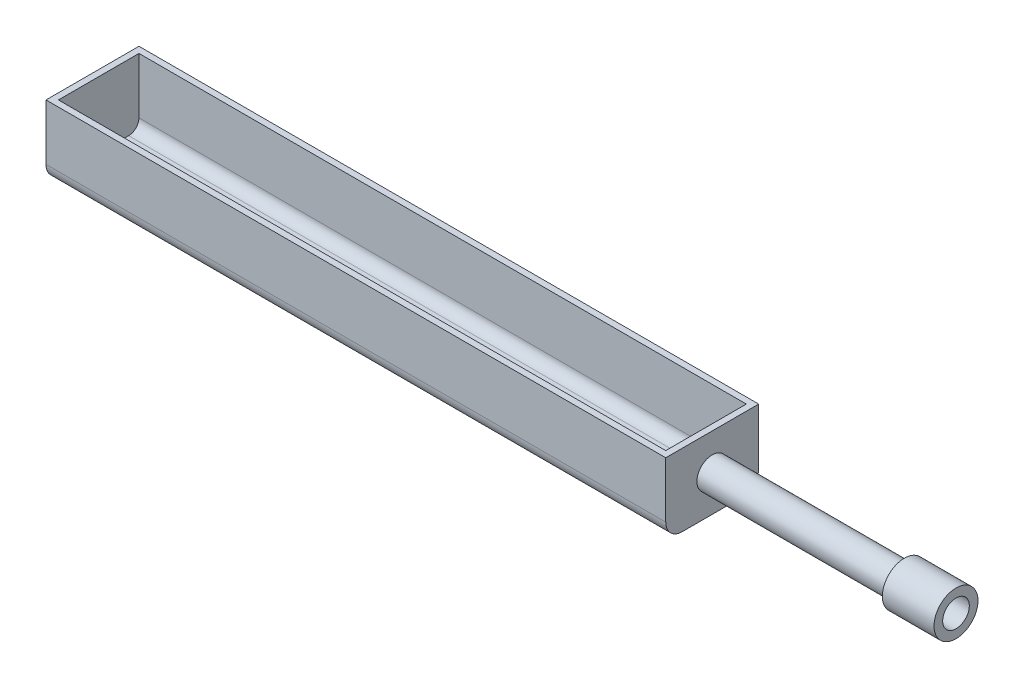
ISO-10303-21;
HEADER;
FILE_DESCRIPTION(('STEP AP214'),'2;1');
FILE_NAME('part.step','',(''),(''),'','','');
FILE_SCHEMA(('AUTOMOTIVE_DESIGN { 1 0 10303 214 1 1 1 1 }'));
ENDSEC;
DATA;
#1=APPLICATION_CONTEXT('core data for automotive mechanical design processes');
#2=APPLICATION_PROTOCOL_DEFINITION('international standard','automotive_design',2000,#1);
#3=PRODUCT_CONTEXT('',#1,'mechanical');
#4=PRODUCT('Part','Part','',(#3));
#5=PRODUCT_RELATED_PRODUCT_CATEGORY('part','',(#4));
#6=PRODUCT_DEFINITION_FORMATION('','',#4);
#7=PRODUCT_DEFINITION_CONTEXT('part definition',#1,'design');
#8=PRODUCT_DEFINITION('design','',#6,#7);
#9=PRODUCT_DEFINITION_SHAPE('','',#8);
#10=(LENGTH_UNIT() NAMED_UNIT(*) SI_UNIT(.MILLI.,.METRE.));
#11=(NAMED_UNIT(*) PLANE_ANGLE_UNIT() SI_UNIT($,.RADIAN.));
#12=(NAMED_UNIT(*) SI_UNIT($,.STERADIAN.) SOLID_ANGLE_UNIT());
#13=UNCERTAINTY_MEASURE_WITH_UNIT(LENGTH_MEASURE(1.E-05),#10,'distance_accuracy_value','');
#14=(GEOMETRIC_REPRESENTATION_CONTEXT(3) GLOBAL_UNCERTAINTY_ASSIGNED_CONTEXT((#13)) GLOBAL_UNIT_ASSIGNED_CONTEXT((#10,
#11,#12)) REPRESENTATION_CONTEXT('',''));
#15=CARTESIAN_POINT('',(0.,0.,0.));
#16=DIRECTION('',(0.,0.,1.));
#17=DIRECTION('',(1.,0.,0.));
#18=AXIS2_PLACEMENT_3D('',#15,#16,#17);
#19=CARTESIAN_POINT('',(300.,17.5,-22.5));
#20=DIRECTION('',(0.,-1.,0.));
#21=DIRECTION('',(0.,0.,-1.));
#22=AXIS2_PLACEMENT_3D('',#19,#20,#21);
#23=PLANE('',#22);
#24=DIRECTION('',(0.,0.,1.));
#25=VECTOR('',#24,1.);
#26=CARTESIAN_POINT('',(0.,17.5,-22.5));
#27=LINE('',#26,#25);
#28=CARTESIAN_POINT('',(0.,17.5,-22.5));
#29=VERTEX_POINT('',#28);
#30=CARTESIAN_POINT('',(0.,17.5,22.5));
#31=VERTEX_POINT('',#30);
#32=EDGE_CURVE('E180',#29,#31,#27,.T.);
#33=ORIENTED_EDGE('',*,*,#32,.T.);
#34=DIRECTION('',(-1.,0.,0.));
#35=VECTOR('',#34,1.);
#36=CARTESIAN_POINT('',(300.,17.5,22.5));
#37=LINE('',#36,#35);
#38=CARTESIAN_POINT('',(300.,17.5,22.5));
#39=VERTEX_POINT('',#38);
#40=EDGE_CURVE('E187',#39,#31,#37,.T.);
#41=ORIENTED_EDGE('',*,*,#40,.F.);
#42=DIRECTION('',(0.,0.,1.));
#43=VECTOR('',#42,1.);
#44=CARTESIAN_POINT('',(300.,17.5,-22.5));
#45=LINE('',#44,#43);
#46=CARTESIAN_POINT('',(300.,17.5,-22.5));
#47=VERTEX_POINT('',#46);
#48=EDGE_CURVE('E185',#47,#39,#45,.T.);
#49=ORIENTED_EDGE('',*,*,#48,.F.);
#50=DIRECTION('',(-1.,0.,0.));
#51=VECTOR('',#50,1.);
#52=CARTESIAN_POINT('',(300.,17.5,-22.5));
#53=LINE('',#52,#51);
#54=EDGE_CURVE('E197',#47,#29,#53,.T.);
#55=ORIENTED_EDGE('',*,*,#54,.T.);
#56=EDGE_LOOP('',(#33,#41,#49,#55));
#57=FACE_BOUND('',#56,.T.);
#58=DIRECTION('',(0.,0.,1.));
#59=VECTOR('',#58,1.);
#60=CARTESIAN_POINT('',(3.,17.5,-22.5));
#61=LINE('',#60,#59);
#62=CARTESIAN_POINT('',(3.,17.5,-19.5));
#63=VERTEX_POINT('',#62);
#64=CARTESIAN_POINT('',(3.,17.5,19.5));
#65=VERTEX_POINT('',#64);
#66=EDGE_CURVE('E144',#63,#65,#61,.T.);
#67=ORIENTED_EDGE('',*,*,#66,.F.);
#68=DIRECTION('',(-1.,0.,0.));
#69=VECTOR('',#68,1.);
#70=CARTESIAN_POINT('',(300.,17.5,-19.5));
#71=LINE('',#70,#69);
#72=CARTESIAN_POINT('',(297.,17.5,-19.5));
#73=VERTEX_POINT('',#72);
#74=EDGE_CURVE('E171',#73,#63,#71,.T.);
#75=ORIENTED_EDGE('',*,*,#74,.F.);
#76=DIRECTION('',(0.,0.,1.));
#77=VECTOR('',#76,1.);
#78=CARTESIAN_POINT('',(297.,17.5,-22.5));
#79=LINE('',#78,#77);
#80=CARTESIAN_POINT('',(297.,17.5,19.5));
#81=VERTEX_POINT('',#80);
#82=EDGE_CURVE('E48',#73,#81,#79,.T.);
#83=ORIENTED_EDGE('',*,*,#82,.T.);
#84=DIRECTION('',(-1.,0.,0.));
#85=VECTOR('',#84,1.);
#86=CARTESIAN_POINT('',(300.,17.5,19.5));
#87=LINE('',#86,#85);
#88=EDGE_CURVE('E142',#81,#65,#87,.T.);
#89=ORIENTED_EDGE('',*,*,#88,.T.);
#90=EDGE_LOOP('',(#67,#75,#83,#89));
#91=FACE_BOUND('',#90,.T.);
#92=ADVANCED_FACE('F32',(#57,#91),#23,.F.);
#93=CARTESIAN_POINT('',(300.,-17.5,22.5));
#94=DIRECTION('',(0.,0.,-1.));
#95=DIRECTION('',(-1.,0.,0.));
#96=AXIS2_PLACEMENT_3D('',#93,#94,#95);
#97=PLANE('',#96);
#98=DIRECTION('',(0.,-1.,0.));
#99=VECTOR('',#98,1.);
#100=CARTESIAN_POINT('',(0.,-17.5,22.5));
#101=LINE('',#100,#99);
#102=CARTESIAN_POINT('',(0.,-9.5,22.5));
#103=VERTEX_POINT('',#102);
#104=EDGE_CURVE('E136',#31,#103,#101,.T.);
#105=ORIENTED_EDGE('',*,*,#104,.T.);
#106=DIRECTION('',(-1.,0.,0.));
#107=VECTOR('',#106,1.);
#108=CARTESIAN_POINT('',(300.,-9.5,22.5));
#109=LINE('',#108,#107);
#110=CARTESIAN_POINT('',(300.,-9.5,22.5));
#111=VERTEX_POINT('',#110);
#112=EDGE_CURVE('E56',#103,#111,#109,.F.);
#113=ORIENTED_EDGE('',*,*,#112,.T.);
#114=DIRECTION('',(0.,-1.,0.));
#115=VECTOR('',#114,1.);
#116=CARTESIAN_POINT('',(300.,-17.5,22.5));
#117=LINE('',#116,#115);
#118=EDGE_CURVE('E177',#39,#111,#117,.T.);
#119=ORIENTED_EDGE('',*,*,#118,.F.);
#120=ORIENTED_EDGE('',*,*,#40,.T.);
#121=EDGE_LOOP('',(#105,#113,#119,#120));
#122=FACE_BOUND('',#121,.T.);
#123=ADVANCED_FACE('F260',(#122),#97,.F.);
#124=CARTESIAN_POINT('',(300.,-17.5,-22.5));
#125=DIRECTION('',(0.,1.,0.));
#126=DIRECTION('',(0.,0.,1.));
#127=AXIS2_PLACEMENT_3D('',#124,#125,#126);
#128=PLANE('',#127);
#129=DIRECTION('',(0.,0.,-1.));
#130=VECTOR('',#129,1.);
#131=CARTESIAN_POINT('',(0.,-17.5,-22.5));
#132=LINE('',#131,#130);
#133=CARTESIAN_POINT('',(0.,-17.5,14.5));
#134=VERTEX_POINT('',#133);
#135=CARTESIAN_POINT('',(0.,-17.5,-14.5));
#136=VERTEX_POINT('',#135);
#137=EDGE_CURVE('E189',#134,#136,#132,.T.);
#138=ORIENTED_EDGE('',*,*,#137,.T.);
#139=DIRECTION('',(-1.,0.,0.));
#140=VECTOR('',#139,1.);
#141=CARTESIAN_POINT('',(300.,-17.5,-14.5));
#142=LINE('',#141,#140);
#143=CARTESIAN_POINT('',(300.,-17.5,-14.5));
#144=VERTEX_POINT('',#143);
#145=EDGE_CURVE('E210',#136,#144,#142,.F.);
#146=ORIENTED_EDGE('',*,*,#145,.T.);
#147=DIRECTION('',(0.,0.,-1.));
#148=VECTOR('',#147,1.);
#149=CARTESIAN_POINT('',(300.,-17.5,-22.5));
#150=LINE('',#149,#148);
#151=CARTESIAN_POINT('',(300.,-17.5,14.5));
#152=VERTEX_POINT('',#151);
#153=EDGE_CURVE('E179',#152,#144,#150,.T.);
#154=ORIENTED_EDGE('',*,*,#153,.F.);
#155=DIRECTION('',(-1.,0.,0.));
#156=VECTOR('',#155,1.);
#157=CARTESIAN_POINT('',(300.,-17.5,14.5));
#158=LINE('',#157,#156);
#159=EDGE_CURVE('E207',#152,#134,#158,.T.);
#160=ORIENTED_EDGE('',*,*,#159,.T.);
#161=EDGE_LOOP('',(#138,#146,#154,#160));
#162=FACE_BOUND('',#161,.T.);
#163=ADVANCED_FACE('F266',(#162),#128,.F.);
#164=CARTESIAN_POINT('',(300.,-17.5,-22.5));
#165=DIRECTION('',(0.,0.,1.));
#166=DIRECTION('',(1.,0.,0.));
#167=AXIS2_PLACEMENT_3D('',#164,#165,#166);
#168=PLANE('',#167);
#169=DIRECTION('',(0.,1.,0.));
#170=VECTOR('',#169,1.);
#171=CARTESIAN_POINT('',(300.,-17.5,-22.5));
#172=LINE('',#171,#170);
#173=CARTESIAN_POINT('',(300.,-9.5,-22.5));
#174=VERTEX_POINT('',#173);
#175=EDGE_CURVE('E183',#174,#47,#172,.T.);
#176=ORIENTED_EDGE('',*,*,#175,.F.);
#177=DIRECTION('',(-1.,0.,0.));
#178=VECTOR('',#177,1.);
#179=CARTESIAN_POINT('',(300.,-9.5,-22.5));
#180=LINE('',#179,#178);
#181=CARTESIAN_POINT('',(0.,-9.5,-22.5));
#182=VERTEX_POINT('',#181);
#183=EDGE_CURVE('E200',#174,#182,#180,.T.);
#184=ORIENTED_EDGE('',*,*,#183,.T.);
#185=DIRECTION('',(0.,1.,0.));
#186=VECTOR('',#185,1.);
#187=CARTESIAN_POINT('',(0.,-17.5,-22.5));
#188=LINE('',#187,#186);
#189=EDGE_CURVE('E192',#182,#29,#188,.T.);
#190=ORIENTED_EDGE('',*,*,#189,.T.);
#191=ORIENTED_EDGE('',*,*,#54,.F.);
#192=EDGE_LOOP('',(#176,#184,#190,#191));
#193=FACE_BOUND('',#192,.T.);
#194=ADVANCED_FACE('F272',(#193),#168,.F.);
#195=CARTESIAN_POINT('',(300.,0.,0.));
#196=DIRECTION('',(1.,0.,0.));
#197=DIRECTION('',(0.,0.,-1.));
#198=AXIS2_PLACEMENT_3D('',#195,#196,#197);
#199=PLANE('',#198);
#200=CARTESIAN_POINT('',(300.,0.,0.));
#201=DIRECTION('',(1.,0.,0.));
#202=DIRECTION('',(0.,0.,-1.));
#203=AXIS2_PLACEMENT_3D('',#200,#201,#202);
#204=CIRCLE('',#203,7.45);
#205=CARTESIAN_POINT('',(300.,0.,-7.45));
#206=VERTEX_POINT('',#205);
#207=EDGE_CURVE('E218',#206,#206,#204,.F.);
#208=ORIENTED_EDGE('',*,*,#207,.T.);
#209=EDGE_LOOP('',(#208));
#210=FACE_BOUND('',#209,.T.);
#211=ORIENTED_EDGE('',*,*,#153,.T.);
#212=CARTESIAN_POINT('',(300.,-9.5,-14.5));
#213=DIRECTION('',(1.,0.,0.));
#214=DIRECTION('',(0.,0.,-1.));
#215=AXIS2_PLACEMENT_3D('',#212,#213,#214);
#216=CIRCLE('',#215,8.);
#217=EDGE_CURVE('E214',#144,#174,#216,.T.);
#218=ORIENTED_EDGE('',*,*,#217,.T.);
#219=ORIENTED_EDGE('',*,*,#175,.T.);
#220=ORIENTED_EDGE('',*,*,#48,.T.);
#221=ORIENTED_EDGE('',*,*,#118,.T.);
#222=CARTESIAN_POINT('',(300.,-9.5,14.5));
#223=DIRECTION('',(1.,0.,0.));
#224=DIRECTION('',(0.,0.,-1.));
#225=AXIS2_PLACEMENT_3D('',#222,#223,#224);
#226=CIRCLE('',#225,8.);
#227=EDGE_CURVE('E212',#111,#152,#226,.T.);
#228=ORIENTED_EDGE('',*,*,#227,.T.);
#229=EDGE_LOOP('',(#211,#218,#219,#220,#221,#228));
#230=FACE_BOUND('',#229,.T.);
#231=ADVANCED_FACE('F275',(#210,#230),#199,.T.);
#232=CARTESIAN_POINT('',(0.,0.,0.));
#233=DIRECTION('',(1.,0.,0.));
#234=DIRECTION('',(0.,0.,-1.));
#235=AXIS2_PLACEMENT_3D('',#232,#233,#234);
#236=PLANE('',#235);
#237=ORIENTED_EDGE('',*,*,#189,.F.);
#238=CARTESIAN_POINT('',(0.,-9.5,-14.5));
#239=DIRECTION('',(1.,0.,0.));
#240=DIRECTION('',(0.,0.,-1.));
#241=AXIS2_PLACEMENT_3D('',#238,#239,#240);
#242=CIRCLE('',#241,8.);
#243=EDGE_CURVE('E205',#182,#136,#242,.F.);
#244=ORIENTED_EDGE('',*,*,#243,.T.);
#245=ORIENTED_EDGE('',*,*,#137,.F.);
#246=CARTESIAN_POINT('',(0.,-9.5,14.5));
#247=DIRECTION('',(1.,0.,0.));
#248=DIRECTION('',(0.,0.,-1.));
#249=AXIS2_PLACEMENT_3D('',#246,#247,#248);
#250=CIRCLE('',#249,8.);
#251=EDGE_CURVE('E203',#134,#103,#250,.F.);
#252=ORIENTED_EDGE('',*,*,#251,.T.);
#253=ORIENTED_EDGE('',*,*,#104,.F.);
#254=ORIENTED_EDGE('',*,*,#32,.F.);
#255=EDGE_LOOP('',(#237,#244,#245,#252,#253,#254));
#256=FACE_BOUND('',#255,.T.);
#257=ADVANCED_FACE('F270',(#256),#236,.F.);
#258=CARTESIAN_POINT('',(300.,-9.5,-14.5));
#259=DIRECTION('',(-1.,0.,0.));
#260=DIRECTION('',(0.,0.,1.));
#261=AXIS2_PLACEMENT_3D('',#258,#259,#260);
#262=CYLINDRICAL_SURFACE('',#261,8.);
#263=ORIENTED_EDGE('',*,*,#217,.F.);
#264=ORIENTED_EDGE('',*,*,#145,.F.);
#265=ORIENTED_EDGE('',*,*,#243,.F.);
#266=ORIENTED_EDGE('',*,*,#183,.F.);
#267=EDGE_LOOP('',(#263,#264,#265,#266));
#268=FACE_BOUND('',#267,.T.);
#269=ADVANCED_FACE('F279',(#268),#262,.T.);
#270=CARTESIAN_POINT('',(300.,-9.5,14.5));
#271=DIRECTION('',(-1.,0.,0.));
#272=DIRECTION('',(0.,0.,1.));
#273=AXIS2_PLACEMENT_3D('',#270,#271,#272);
#274=CYLINDRICAL_SURFACE('',#273,8.);
#275=ORIENTED_EDGE('',*,*,#227,.F.);
#276=ORIENTED_EDGE('',*,*,#112,.F.);
#277=ORIENTED_EDGE('',*,*,#251,.F.);
#278=ORIENTED_EDGE('',*,*,#159,.F.);
#279=EDGE_LOOP('',(#275,#276,#277,#278));
#280=FACE_BOUND('',#279,.T.);
#281=ADVANCED_FACE('F34',(#280),#274,.T.);
#282=CARTESIAN_POINT('',(300.,-17.5,19.5));
#283=DIRECTION('',(0.,0.,-1.));
#284=DIRECTION('',(-1.,0.,0.));
#285=AXIS2_PLACEMENT_3D('',#282,#283,#284);
#286=PLANE('',#285);
#287=DIRECTION('',(0.,-1.,0.));
#288=VECTOR('',#287,1.);
#289=CARTESIAN_POINT('',(3.,-17.5,19.5));
#290=LINE('',#289,#288);
#291=CARTESIAN_POINT('',(3.,-9.5,19.5));
#292=VERTEX_POINT('',#291);
#293=EDGE_CURVE('E161',#65,#292,#290,.T.);
#294=ORIENTED_EDGE('',*,*,#293,.F.);
#295=ORIENTED_EDGE('',*,*,#88,.F.);
#296=DIRECTION('',(0.,-1.,0.));
#297=VECTOR('',#296,1.);
#298=CARTESIAN_POINT('',(297.,-17.5,19.5));
#299=LINE('',#298,#297);
#300=CARTESIAN_POINT('',(297.,-9.5,19.5));
#301=VERTEX_POINT('',#300);
#302=EDGE_CURVE('E139',#81,#301,#299,.T.);
#303=ORIENTED_EDGE('',*,*,#302,.T.);
#304=DIRECTION('',(-1.,0.,0.));
#305=VECTOR('',#304,1.);
#306=CARTESIAN_POINT('',(300.,-9.5,19.5));
#307=LINE('',#306,#305);
#308=EDGE_CURVE('E125',#292,#301,#307,.F.);
#309=ORIENTED_EDGE('',*,*,#308,.F.);
#310=EDGE_LOOP('',(#294,#295,#303,#309));
#311=FACE_BOUND('',#310,.T.);
#312=ADVANCED_FACE('F140',(#311),#286,.T.);
#313=CARTESIAN_POINT('',(300.,-14.5,-22.5));
#314=DIRECTION('',(0.,1.,0.));
#315=DIRECTION('',(0.,0.,1.));
#316=AXIS2_PLACEMENT_3D('',#313,#314,#315);
#317=PLANE('',#316);
#318=DIRECTION('',(0.,0.,-1.));
#319=VECTOR('',#318,1.);
#320=CARTESIAN_POINT('',(3.,-14.5,-22.5));
#321=LINE('',#320,#319);
#322=CARTESIAN_POINT('',(3.,-14.5,14.5));
#323=VERTEX_POINT('',#322);
#324=CARTESIAN_POINT('',(3.,-14.5,-14.5));
#325=VERTEX_POINT('',#324);
#326=EDGE_CURVE('E158',#323,#325,#321,.T.);
#327=ORIENTED_EDGE('',*,*,#326,.F.);
#328=DIRECTION('',(1.,0.,0.));
#329=VECTOR('',#328,1.);
#330=CARTESIAN_POINT('',(300.,-14.5,14.5));
#331=LINE('',#330,#329);
#332=CARTESIAN_POINT('',(297.,-14.5,14.5));
#333=VERTEX_POINT('',#332);
#334=EDGE_CURVE('E153',#333,#323,#331,.F.);
#335=ORIENTED_EDGE('',*,*,#334,.F.);
#336=DIRECTION('',(0.,0.,-1.));
#337=VECTOR('',#336,1.);
#338=CARTESIAN_POINT('',(297.,-14.5,-22.5));
#339=LINE('',#338,#337);
#340=CARTESIAN_POINT('',(297.,-14.5,-14.5));
#341=VERTEX_POINT('',#340);
#342=EDGE_CURVE('E143',#333,#341,#339,.T.);
#343=ORIENTED_EDGE('',*,*,#342,.T.);
#344=DIRECTION('',(1.,0.,0.));
#345=VECTOR('',#344,1.);
#346=CARTESIAN_POINT('',(300.,-14.5,-14.5));
#347=LINE('',#346,#345);
#348=EDGE_CURVE('E150',#325,#341,#347,.T.);
#349=ORIENTED_EDGE('',*,*,#348,.F.);
#350=EDGE_LOOP('',(#327,#335,#343,#349));
#351=FACE_BOUND('',#350,.T.);
#352=ADVANCED_FACE('F250',(#351),#317,.T.);
#353=CARTESIAN_POINT('',(300.,-17.5,-19.5));
#354=DIRECTION('',(0.,0.,1.));
#355=DIRECTION('',(1.,0.,0.));
#356=AXIS2_PLACEMENT_3D('',#353,#354,#355);
#357=PLANE('',#356);
#358=DIRECTION('',(0.,1.,0.));
#359=VECTOR('',#358,1.);
#360=CARTESIAN_POINT('',(297.,-17.5,-19.5));
#361=LINE('',#360,#359);
#362=CARTESIAN_POINT('',(297.,-9.5,-19.5));
#363=VERTEX_POINT('',#362);
#364=EDGE_CURVE('E157',#363,#73,#361,.T.);
#365=ORIENTED_EDGE('',*,*,#364,.T.);
#366=ORIENTED_EDGE('',*,*,#74,.T.);
#367=DIRECTION('',(0.,1.,0.));
#368=VECTOR('',#367,1.);
#369=CARTESIAN_POINT('',(3.,-17.5,-19.5));
#370=LINE('',#369,#368);
#371=CARTESIAN_POINT('',(3.,-9.5,-19.5));
#372=VERTEX_POINT('',#371);
#373=EDGE_CURVE('E160',#372,#63,#370,.T.);
#374=ORIENTED_EDGE('',*,*,#373,.F.);
#375=DIRECTION('',(1.,0.,0.));
#376=VECTOR('',#375,1.);
#377=CARTESIAN_POINT('',(300.,-9.5,-19.5));
#378=LINE('',#377,#376);
#379=EDGE_CURVE('E168',#363,#372,#378,.F.);
#380=ORIENTED_EDGE('',*,*,#379,.F.);
#381=EDGE_LOOP('',(#365,#366,#374,#380));
#382=FACE_BOUND('',#381,.T.);
#383=ADVANCED_FACE('F241',(#382),#357,.T.);
#384=CARTESIAN_POINT('',(297.,0.,0.));
#385=DIRECTION('',(1.,0.,0.));
#386=DIRECTION('',(0.,0.,-1.));
#387=AXIS2_PLACEMENT_3D('',#384,#385,#386);
#388=PLANE('',#387);
#389=CARTESIAN_POINT('',(297.,0.,0.));
#390=DIRECTION('',(1.,0.,0.));
#391=DIRECTION('',(0.,0.,-1.));
#392=AXIS2_PLACEMENT_3D('',#389,#390,#391);
#393=CIRCLE('',#392,7.45);
#394=CARTESIAN_POINT('',(297.,0.,-7.45));
#395=VERTEX_POINT('',#394);
#396=EDGE_CURVE('E36',#395,#395,#393,.F.);
#397=ORIENTED_EDGE('',*,*,#396,.F.);
#398=EDGE_LOOP('',(#397));
#399=FACE_BOUND('',#398,.T.);
#400=ORIENTED_EDGE('',*,*,#342,.F.);
#401=CARTESIAN_POINT('',(297.,-9.5,14.5));
#402=DIRECTION('',(1.,0.,0.));
#403=DIRECTION('',(0.,0.,-1.));
#404=AXIS2_PLACEMENT_3D('',#401,#402,#403);
#405=CIRCLE('',#404,5.);
#406=EDGE_CURVE('E130',#301,#333,#405,.T.);
#407=ORIENTED_EDGE('',*,*,#406,.F.);
#408=ORIENTED_EDGE('',*,*,#302,.F.);
#409=ORIENTED_EDGE('',*,*,#82,.F.);
#410=ORIENTED_EDGE('',*,*,#364,.F.);
#411=CARTESIAN_POINT('',(297.,-9.5,-14.5));
#412=DIRECTION('',(1.,0.,0.));
#413=DIRECTION('',(0.,0.,-1.));
#414=AXIS2_PLACEMENT_3D('',#411,#412,#413);
#415=CIRCLE('',#414,5.);
#416=EDGE_CURVE('E137',#341,#363,#415,.T.);
#417=ORIENTED_EDGE('',*,*,#416,.F.);
#418=EDGE_LOOP('',(#400,#407,#408,#409,#410,#417));
#419=FACE_BOUND('',#418,.T.);
#420=ADVANCED_FACE('F146',(#399,#419),#388,.F.);
#421=CARTESIAN_POINT('',(3.,0.,0.));
#422=DIRECTION('',(1.,0.,0.));
#423=DIRECTION('',(0.,0.,-1.));
#424=AXIS2_PLACEMENT_3D('',#421,#422,#423);
#425=PLANE('',#424);
#426=ORIENTED_EDGE('',*,*,#373,.T.);
#427=ORIENTED_EDGE('',*,*,#66,.T.);
#428=ORIENTED_EDGE('',*,*,#293,.T.);
#429=CARTESIAN_POINT('',(3.,-9.5,14.5));
#430=DIRECTION('',(1.,0.,0.));
#431=DIRECTION('',(0.,0.,-1.));
#432=AXIS2_PLACEMENT_3D('',#429,#430,#431);
#433=CIRCLE('',#432,5.);
#434=EDGE_CURVE('E132',#323,#292,#433,.F.);
#435=ORIENTED_EDGE('',*,*,#434,.F.);
#436=ORIENTED_EDGE('',*,*,#326,.T.);
#437=CARTESIAN_POINT('',(3.,-9.5,-14.5));
#438=DIRECTION('',(1.,0.,0.));
#439=DIRECTION('',(0.,0.,-1.));
#440=AXIS2_PLACEMENT_3D('',#437,#438,#439);
#441=CIRCLE('',#440,5.);
#442=EDGE_CURVE('E164',#372,#325,#441,.F.);
#443=ORIENTED_EDGE('',*,*,#442,.F.);
#444=EDGE_LOOP('',(#426,#427,#428,#435,#436,#443));
#445=FACE_BOUND('',#444,.T.);
#446=ADVANCED_FACE('F246',(#445),#425,.T.);
#447=CARTESIAN_POINT('',(300.,-9.5,-14.5));
#448=DIRECTION('',(-1.,0.,0.));
#449=DIRECTION('',(0.,0.,1.));
#450=AXIS2_PLACEMENT_3D('',#447,#448,#449);
#451=CYLINDRICAL_SURFACE('',#450,5.);
#452=ORIENTED_EDGE('',*,*,#416,.T.);
#453=ORIENTED_EDGE('',*,*,#379,.T.);
#454=ORIENTED_EDGE('',*,*,#442,.T.);
#455=ORIENTED_EDGE('',*,*,#348,.T.);
#456=EDGE_LOOP('',(#452,#453,#454,#455));
#457=FACE_BOUND('',#456,.T.);
#458=ADVANCED_FACE('F249',(#457),#451,.F.);
#459=CARTESIAN_POINT('',(300.,-9.5,14.5));
#460=DIRECTION('',(-1.,0.,0.));
#461=DIRECTION('',(0.,0.,1.));
#462=AXIS2_PLACEMENT_3D('',#459,#460,#461);
#463=CYLINDRICAL_SURFACE('',#462,5.);
#464=ORIENTED_EDGE('',*,*,#406,.T.);
#465=ORIENTED_EDGE('',*,*,#334,.T.);
#466=ORIENTED_EDGE('',*,*,#434,.T.);
#467=ORIENTED_EDGE('',*,*,#308,.T.);
#468=EDGE_LOOP('',(#464,#465,#466,#467));
#469=FACE_BOUND('',#468,.T.);
#470=ADVANCED_FACE('F127',(#469),#463,.F.);
#471=CARTESIAN_POINT('',(393.,0.,0.));
#472=DIRECTION('',(-1.,0.,0.));
#473=DIRECTION('',(0.,0.,1.));
#474=AXIS2_PLACEMENT_3D('',#471,#472,#473);
#475=CYLINDRICAL_SURFACE('',#474,7.45);
#476=CARTESIAN_POINT('',(290.,0.,0.));
#477=DIRECTION('',(1.,0.,0.));
#478=DIRECTION('',(0.,0.,-1.));
#479=AXIS2_PLACEMENT_3D('',#476,#477,#478);
#480=CIRCLE('',#479,7.45);
#481=CARTESIAN_POINT('',(290.,0.,-7.45));
#482=VERTEX_POINT('',#481);
#483=EDGE_CURVE('E225',#482,#482,#480,.T.);
#484=ORIENTED_EDGE('',*,*,#483,.T.);
#485=EDGE_LOOP('',(#484));
#486=FACE_BOUND('',#485,.T.);
#487=ORIENTED_EDGE('',*,*,#396,.T.);
#488=EDGE_LOOP('',(#487));
#489=FACE_BOUND('',#488,.T.);
#490=ADVANCED_FACE('F352',(#486,#489),#475,.T.);
#491=CARTESIAN_POINT('',(290.,0.,0.));
#492=DIRECTION('',(1.,0.,0.));
#493=DIRECTION('',(0.,0.,-1.));
#494=AXIS2_PLACEMENT_3D('',#491,#492,#493);
#495=PLANE('',#494);
#496=ORIENTED_EDGE('',*,*,#483,.F.);
#497=EDGE_LOOP('',(#496));
#498=FACE_BOUND('',#497,.T.);
#499=CARTESIAN_POINT('',(290.,0.,0.));
#500=DIRECTION('',(1.,0.,0.));
#501=DIRECTION('',(0.,0.,-1.));
#502=AXIS2_PLACEMENT_3D('',#499,#500,#501);
#503=CIRCLE('',#502,6.45);
#504=CARTESIAN_POINT('',(290.,0.,-6.45));
#505=VERTEX_POINT('',#504);
#506=EDGE_CURVE('E230',#505,#505,#503,.T.);
#507=ORIENTED_EDGE('',*,*,#506,.T.);
#508=EDGE_LOOP('',(#507));
#509=FACE_BOUND('',#508,.T.);
#510=ADVANCED_FACE('F340',(#498,#509),#495,.F.);
#511=CARTESIAN_POINT('',(393.,0.,0.));
#512=DIRECTION('',(-1.,0.,0.));
#513=DIRECTION('',(0.,0.,1.));
#514=AXIS2_PLACEMENT_3D('',#511,#512,#513);
#515=CYLINDRICAL_SURFACE('',#514,6.45);
#516=ORIENTED_EDGE('',*,*,#506,.F.);
#517=EDGE_LOOP('',(#516));
#518=FACE_BOUND('',#517,.T.);
#519=CARTESIAN_POINT('',(297.,0.,0.));
#520=DIRECTION('',(1.,0.,0.));
#521=DIRECTION('',(0.,0.,-1.));
#522=AXIS2_PLACEMENT_3D('',#519,#520,#521);
#523=CIRCLE('',#522,6.45);
#524=CARTESIAN_POINT('',(297.,0.,-6.45));
#525=VERTEX_POINT('',#524);
#526=EDGE_CURVE('E216',#525,#525,#523,.F.);
#527=ORIENTED_EDGE('',*,*,#526,.F.);
#528=EDGE_LOOP('',(#527));
#529=FACE_BOUND('',#528,.T.);
#530=ADVANCED_FACE('F319',(#518,#529),#515,.F.);
#531=ORIENTED_EDGE('',*,*,#207,.F.);
#532=EDGE_LOOP('',(#531));
#533=FACE_BOUND('',#532,.T.);
#534=CARTESIAN_POINT('',(393.,0.,0.));
#535=DIRECTION('',(1.,0.,0.));
#536=DIRECTION('',(0.,0.,-1.));
#537=AXIS2_PLACEMENT_3D('',#534,#535,#536);
#538=CIRCLE('',#537,7.45);
#539=CARTESIAN_POINT('',(393.,0.,-7.45));
#540=VERTEX_POINT('',#539);
#541=EDGE_CURVE('E219',#540,#540,#538,.T.);
#542=ORIENTED_EDGE('',*,*,#541,.F.);
#543=EDGE_LOOP('',(#542));
#544=FACE_BOUND('',#543,.T.);
#545=ADVANCED_FACE('F344',(#533,#544),#475,.T.);
#546=ORIENTED_EDGE('',*,*,#526,.T.);
#547=EDGE_LOOP('',(#546));
#548=FACE_BOUND('',#547,.T.);
#549=ADVANCED_FACE('F349',(#548),#388,.F.);
#550=CARTESIAN_POINT('',(393.,0.,0.));
#551=DIRECTION('',(1.,0.,0.));
#552=DIRECTION('',(0.,0.,-1.));
#553=AXIS2_PLACEMENT_3D('',#550,#551,#552);
#554=PLANE('',#553);
#555=CARTESIAN_POINT('',(393.,0.,0.));
#556=DIRECTION('',(1.,0.,0.));
#557=DIRECTION('',(0.,0.,-1.));
#558=AXIS2_PLACEMENT_3D('',#555,#556,#557);
#559=CIRCLE('',#558,10.65);
#560=CARTESIAN_POINT('',(393.,0.,-10.65));
#561=VERTEX_POINT('',#560);
#562=EDGE_CURVE('E329',#561,#561,#559,.T.);
#563=ORIENTED_EDGE('',*,*,#562,.F.);
#564=EDGE_LOOP('',(#563));
#565=FACE_BOUND('',#564,.T.);
#566=ORIENTED_EDGE('',*,*,#541,.T.);
#567=EDGE_LOOP('',(#566));
#568=FACE_BOUND('',#567,.T.);
#569=ADVANCED_FACE('F356',(#565,#568),#554,.F.);
#570=CARTESIAN_POINT('',(418.,0.,0.));
#571=DIRECTION('',(1.,0.,0.));
#572=DIRECTION('',(0.,0.,-1.));
#573=AXIS2_PLACEMENT_3D('',#570,#571,#572);
#574=PLANE('',#573);
#575=CARTESIAN_POINT('',(418.,0.,0.));
#576=DIRECTION('',(1.,0.,0.));
#577=DIRECTION('',(0.,0.,-1.));
#578=AXIS2_PLACEMENT_3D('',#575,#576,#577);
#579=CIRCLE('',#578,10.65);
#580=CARTESIAN_POINT('',(418.,0.,-10.65));
#581=VERTEX_POINT('',#580);
#582=EDGE_CURVE('E332',#581,#581,#579,.T.);
#583=ORIENTED_EDGE('',*,*,#582,.T.);
#584=EDGE_LOOP('',(#583));
#585=FACE_BOUND('',#584,.T.);
#586=CARTESIAN_POINT('',(418.,0.,0.));
#587=DIRECTION('',(1.,0.,0.));
#588=DIRECTION('',(0.,0.,-1.));
#589=AXIS2_PLACEMENT_3D('',#586,#587,#588);
#590=CIRCLE('',#589,6.45);
#591=CARTESIAN_POINT('',(418.,0.,-6.45));
#592=VERTEX_POINT('',#591);
#593=EDGE_CURVE('E327',#592,#592,#590,.T.);
#594=ORIENTED_EDGE('',*,*,#593,.F.);
#595=EDGE_LOOP('',(#594));
#596=FACE_BOUND('',#595,.T.);
#597=ADVANCED_FACE('F320',(#585,#596),#574,.T.);
#598=CARTESIAN_POINT('',(418.,0.,0.));
#599=DIRECTION('',(-1.,0.,0.));
#600=DIRECTION('',(0.,0.,1.));
#601=AXIS2_PLACEMENT_3D('',#598,#599,#600);
#602=CYLINDRICAL_SURFACE('',#601,10.65);
#603=ORIENTED_EDGE('',*,*,#582,.F.);
#604=EDGE_LOOP('',(#603));
#605=FACE_BOUND('',#604,.T.);
#606=ORIENTED_EDGE('',*,*,#562,.T.);
#607=EDGE_LOOP('',(#606));
#608=FACE_BOUND('',#607,.T.);
#609=ADVANCED_FACE('F311',(#605,#608),#602,.T.);
#610=CARTESIAN_POINT('',(300.,0.,0.));
#611=DIRECTION('',(1.,0.,0.));
#612=DIRECTION('',(0.,0.,-1.));
#613=AXIS2_PLACEMENT_3D('',#610,#611,#612);
#614=CIRCLE('',#613,6.45);
#615=CARTESIAN_POINT('',(300.,0.,-6.45));
#616=VERTEX_POINT('',#615);
#617=EDGE_CURVE('E11',#616,#616,#614,.F.);
#618=ORIENTED_EDGE('',*,*,#617,.F.);
#619=EDGE_LOOP('',(#618));
#620=FACE_BOUND('',#619,.T.);
#621=ADVANCED_FACE('F305',(#620),#199,.T.);
#622=ORIENTED_EDGE('',*,*,#617,.T.);
#623=EDGE_LOOP('',(#622));
#624=FACE_BOUND('',#623,.T.);
#625=ORIENTED_EDGE('',*,*,#593,.T.);
#626=EDGE_LOOP('',(#625));
#627=FACE_BOUND('',#626,.T.);
#628=ADVANCED_FACE('F310',(#624,#627),#515,.F.);
#629=CLOSED_SHELL('',(#92,#123,#163,#194,#231,#257,#269,#281,#312,#352,#383,#420,#446,#458,#470,
#490,#510,#530,#545,#549,#569,#597,#609,#621,#628));
#630=MANIFOLD_SOLID_BREP('B2',#629);
#631=ADVANCED_BREP_SHAPE_REPRESENTATION('',(#18,#630),#14);
#632=SHAPE_DEFINITION_REPRESENTATION(#9,#631);
ENDSEC;
END-ISO-10303-21;
